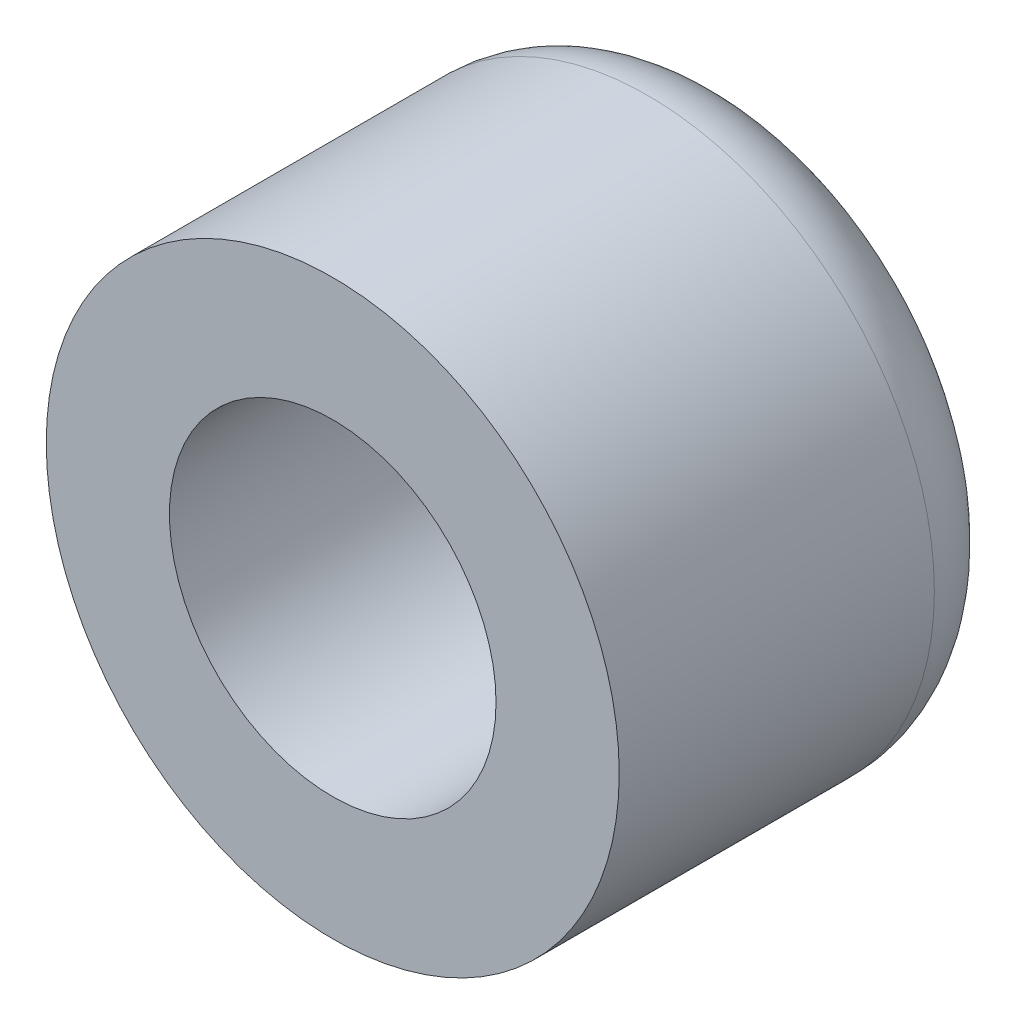
ISO-10303-21;
HEADER;
FILE_DESCRIPTION(('STEP AP214'),'2;1');
FILE_NAME('part.step','',(''),(''),'','','');
FILE_SCHEMA(('AUTOMOTIVE_DESIGN { 1 0 10303 214 1 1 1 1 }'));
ENDSEC;
DATA;
#1=APPLICATION_CONTEXT('core data for automotive mechanical design processes');
#2=APPLICATION_PROTOCOL_DEFINITION('international standard','automotive_design',2000,#1);
#3=PRODUCT_CONTEXT('',#1,'mechanical');
#4=PRODUCT('Part','Part','',(#3));
#5=PRODUCT_RELATED_PRODUCT_CATEGORY('part','',(#4));
#6=PRODUCT_DEFINITION_FORMATION('','',#4);
#7=PRODUCT_DEFINITION_CONTEXT('part definition',#1,'design');
#8=PRODUCT_DEFINITION('design','',#6,#7);
#9=PRODUCT_DEFINITION_SHAPE('','',#8);
#10=(LENGTH_UNIT() NAMED_UNIT(*) SI_UNIT(.MILLI.,.METRE.));
#11=(NAMED_UNIT(*) PLANE_ANGLE_UNIT() SI_UNIT($,.RADIAN.));
#12=(NAMED_UNIT(*) SI_UNIT($,.STERADIAN.) SOLID_ANGLE_UNIT());
#13=UNCERTAINTY_MEASURE_WITH_UNIT(LENGTH_MEASURE(1.E-05),#10,'distance_accuracy_value','');
#14=(GEOMETRIC_REPRESENTATION_CONTEXT(3) GLOBAL_UNCERTAINTY_ASSIGNED_CONTEXT((#13)) GLOBAL_UNIT_ASSIGNED_CONTEXT((#10,
#11,#12)) REPRESENTATION_CONTEXT('',''));
#15=CARTESIAN_POINT('',(0.,0.,0.));
#16=DIRECTION('',(0.,0.,1.));
#17=DIRECTION('',(1.,0.,0.));
#18=AXIS2_PLACEMENT_3D('',#15,#16,#17);
#19=CARTESIAN_POINT('',(0.,0.,7.));
#20=DIRECTION('',(0.,0.,-1.));
#21=DIRECTION('',(-1.,0.,0.));
#22=AXIS2_PLACEMENT_3D('',#19,#20,#21);
#23=CYLINDRICAL_SURFACE('',#22,5.);
#24=CARTESIAN_POINT('',(0.,0.,1.5));
#25=DIRECTION('',(0.,0.,1.));
#26=DIRECTION('',(1.,0.,0.));
#27=AXIS2_PLACEMENT_3D('',#24,#25,#26);
#28=CIRCLE('',#27,5.);
#29=CARTESIAN_POINT('',(5.,0.,1.5));
#30=VERTEX_POINT('',#29);
#31=EDGE_CURVE('E51',#30,#30,#28,.T.);
#32=ORIENTED_EDGE('',*,*,#31,.T.);
#33=EDGE_LOOP('',(#32));
#34=FACE_BOUND('',#33,.T.);
#35=CARTESIAN_POINT('',(0.,0.,7.));
#36=DIRECTION('',(0.,0.,1.));
#37=DIRECTION('',(1.,0.,0.));
#38=AXIS2_PLACEMENT_3D('',#35,#36,#37);
#39=CIRCLE('',#38,5.);
#40=CARTESIAN_POINT('',(5.,0.,7.));
#41=VERTEX_POINT('',#40);
#42=EDGE_CURVE('E56',#41,#41,#39,.T.);
#43=ORIENTED_EDGE('',*,*,#42,.F.);
#44=EDGE_LOOP('',(#43));
#45=FACE_BOUND('',#44,.T.);
#46=ADVANCED_FACE('F43',(#34,#45),#23,.T.);
#47=CARTESIAN_POINT('',(0.,0.,7.));
#48=DIRECTION('',(0.,0.,1.));
#49=DIRECTION('',(1.,0.,0.));
#50=AXIS2_PLACEMENT_3D('',#47,#48,#49);
#51=PLANE('',#50);
#52=CARTESIAN_POINT('',(0.,0.,7.));
#53=DIRECTION('',(0.,0.,1.));
#54=DIRECTION('',(1.,0.,0.));
#55=AXIS2_PLACEMENT_3D('',#52,#53,#54);
#56=CIRCLE('',#55,2.85);
#57=CARTESIAN_POINT('',(2.85,0.,7.));
#58=VERTEX_POINT('',#57);
#59=EDGE_CURVE('E64',#58,#58,#56,.T.);
#60=ORIENTED_EDGE('',*,*,#59,.F.);
#61=EDGE_LOOP('',(#60));
#62=FACE_BOUND('',#61,.T.);
#63=ORIENTED_EDGE('',*,*,#42,.T.);
#64=EDGE_LOOP('',(#63));
#65=FACE_BOUND('',#64,.T.);
#66=ADVANCED_FACE('F81',(#62,#65),#51,.T.);
#67=CARTESIAN_POINT('',(0.,0.,0.));
#68=DIRECTION('',(0.,0.,1.));
#69=DIRECTION('',(1.,0.,0.));
#70=AXIS2_PLACEMENT_3D('',#67,#68,#69);
#71=PLANE('',#70);
#72=CARTESIAN_POINT('',(0.,0.,0.));
#73=DIRECTION('',(0.,0.,1.));
#74=DIRECTION('',(1.,0.,0.));
#75=AXIS2_PLACEMENT_3D('',#72,#73,#74);
#76=CIRCLE('',#75,3.5);
#77=CARTESIAN_POINT('',(3.5,0.,0.));
#78=VERTEX_POINT('',#77);
#79=EDGE_CURVE('E10',#78,#78,#76,.F.);
#80=ORIENTED_EDGE('',*,*,#79,.T.);
#81=EDGE_LOOP('',(#80));
#82=FACE_BOUND('',#81,.T.);
#83=ADVANCED_FACE('F77',(#82),#71,.F.);
#84=CARTESIAN_POINT('',(0.,0.,1.5));
#85=DIRECTION('',(0.,0.,1.));
#86=DIRECTION('',(1.,0.,0.));
#87=AXIS2_PLACEMENT_3D('',#84,#85,#86);
#88=CYLINDRICAL_SURFACE('',#87,2.85);
#89=CARTESIAN_POINT('',(0.,0.,1.5));
#90=DIRECTION('',(0.,0.,1.));
#91=DIRECTION('',(1.,0.,0.));
#92=AXIS2_PLACEMENT_3D('',#89,#90,#91);
#93=CIRCLE('',#92,2.85);
#94=CARTESIAN_POINT('',(2.85,0.,1.5));
#95=VERTEX_POINT('',#94);
#96=EDGE_CURVE('E61',#95,#95,#93,.T.);
#97=ORIENTED_EDGE('',*,*,#96,.F.);
#98=EDGE_LOOP('',(#97));
#99=FACE_BOUND('',#98,.T.);
#100=ORIENTED_EDGE('',*,*,#59,.T.);
#101=EDGE_LOOP('',(#100));
#102=FACE_BOUND('',#101,.T.);
#103=ADVANCED_FACE('F74',(#99,#102),#88,.F.);
#104=CARTESIAN_POINT('',(0.,0.,1.5));
#105=DIRECTION('',(0.,0.,1.));
#106=DIRECTION('',(1.,0.,0.));
#107=AXIS2_PLACEMENT_3D('',#104,#105,#106);
#108=PLANE('',#107);
#109=ORIENTED_EDGE('',*,*,#96,.T.);
#110=EDGE_LOOP('',(#109));
#111=FACE_BOUND('',#110,.T.);
#112=ADVANCED_FACE('F72',(#111),#108,.T.);
#113=CARTESIAN_POINT('',(0.,0.,1.5));
#114=DIRECTION('',(0.,0.,1.));
#115=DIRECTION('',(1.,0.,0.));
#116=AXIS2_PLACEMENT_3D('',#113,#114,#115);
#117=TOROIDAL_SURFACE('',#116,3.5,1.5);
#118=ORIENTED_EDGE('',*,*,#79,.F.);
#119=EDGE_LOOP('',(#118));
#120=FACE_BOUND('',#119,.T.);
#121=ORIENTED_EDGE('',*,*,#31,.F.);
#122=EDGE_LOOP('',(#121));
#123=FACE_BOUND('',#122,.T.);
#124=ADVANCED_FACE('F45',(#120,#123),#117,.T.);
#125=CLOSED_SHELL('',(#46,#66,#83,#103,#112,#124));
#126=MANIFOLD_SOLID_BREP('B2',#125);
#127=ADVANCED_BREP_SHAPE_REPRESENTATION('',(#18,#126),#14);
#128=SHAPE_DEFINITION_REPRESENTATION(#9,#127);
ENDSEC;
END-ISO-10303-21;
